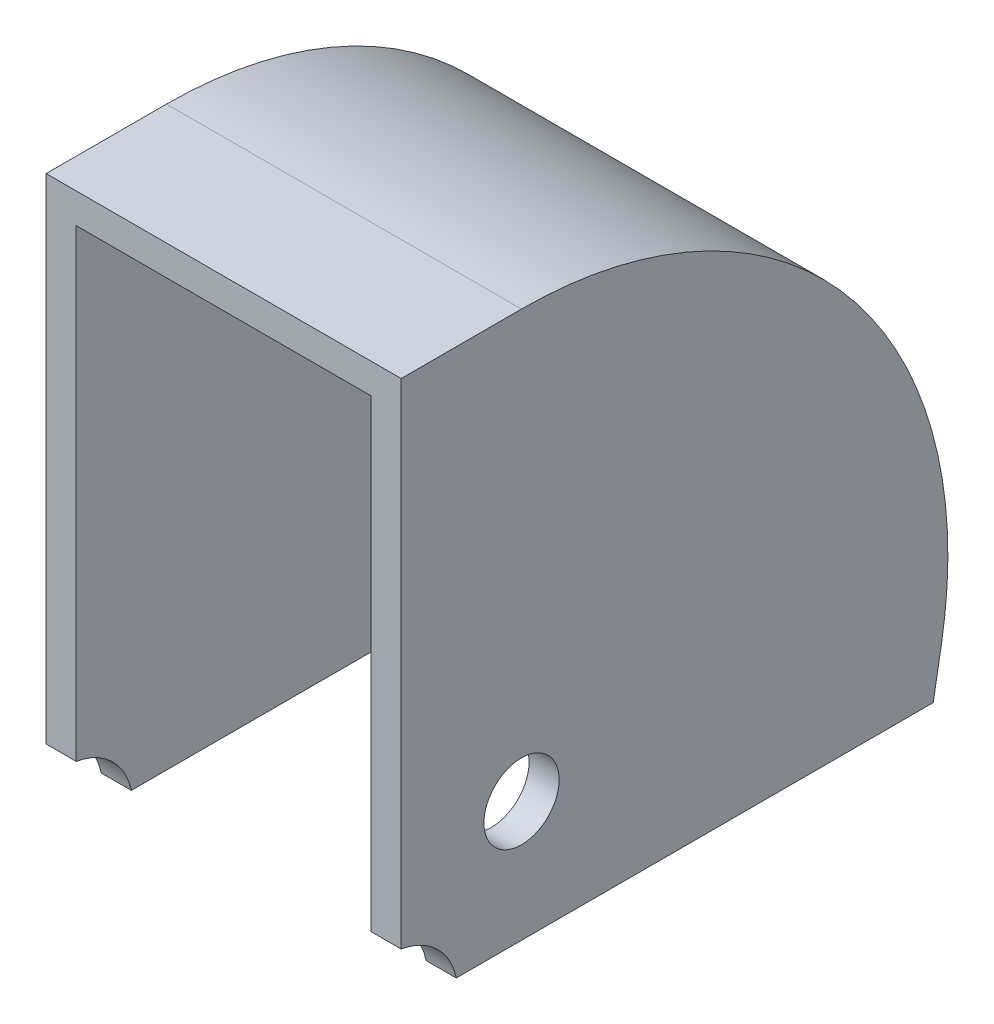
ISO-10303-21;
HEADER;
FILE_DESCRIPTION(('STEP AP214'),'2;1');
FILE_NAME('part.step','',(''),(''),'','','');
FILE_SCHEMA(('AUTOMOTIVE_DESIGN { 1 0 10303 214 1 1 1 1 }'));
ENDSEC;
DATA;
#1=APPLICATION_CONTEXT('core data for automotive mechanical design processes');
#2=APPLICATION_PROTOCOL_DEFINITION('international standard','automotive_design',2000,#1);
#3=PRODUCT_CONTEXT('',#1,'mechanical');
#4=PRODUCT('Part','Part','',(#3));
#5=PRODUCT_RELATED_PRODUCT_CATEGORY('part','',(#4));
#6=PRODUCT_DEFINITION_FORMATION('','',#4);
#7=PRODUCT_DEFINITION_CONTEXT('part definition',#1,'design');
#8=PRODUCT_DEFINITION('design','',#6,#7);
#9=PRODUCT_DEFINITION_SHAPE('','',#8);
#10=(LENGTH_UNIT() NAMED_UNIT(*) SI_UNIT(.MILLI.,.METRE.));
#11=(NAMED_UNIT(*) PLANE_ANGLE_UNIT() SI_UNIT($,.RADIAN.));
#12=(NAMED_UNIT(*) SI_UNIT($,.STERADIAN.) SOLID_ANGLE_UNIT());
#13=UNCERTAINTY_MEASURE_WITH_UNIT(LENGTH_MEASURE(1.E-05),#10,'distance_accuracy_value','');
#14=(GEOMETRIC_REPRESENTATION_CONTEXT(3) GLOBAL_UNCERTAINTY_ASSIGNED_CONTEXT((#13)) GLOBAL_UNIT_ASSIGNED_CONTEXT((#10,
#11,#12)) REPRESENTATION_CONTEXT('',''));
#15=CARTESIAN_POINT('',(0.,0.,0.));
#16=DIRECTION('',(0.,0.,1.));
#17=DIRECTION('',(1.,0.,0.));
#18=AXIS2_PLACEMENT_3D('',#15,#16,#17);
#19=CARTESIAN_POINT('',(2.,-8.93931415777547,8.73653907470971));
#20=DIRECTION('',(-1.,0.,0.));
#21=DIRECTION('',(0.,0.,1.));
#22=AXIS2_PLACEMENT_3D('',#19,#20,#21);
#23=CYLINDRICAL_SURFACE('',#22,4.5);
#24=CARTESIAN_POINT('',(0.,-8.93931415777547,8.73653907470971));
#25=DIRECTION('',(-1.,0.,0.));
#26=DIRECTION('',(0.,0.,1.));
#27=AXIS2_PLACEMENT_3D('',#24,#25,#26);
#28=CIRCLE('',#27,4.5);
#29=CARTESIAN_POINT('',(0.,-4.5,8.));
#30=VERTEX_POINT('',#29);
#31=CARTESIAN_POINT('',(0.,-8.,4.33566542133103));
#32=VERTEX_POINT('',#31);
#33=EDGE_CURVE('E191',#30,#32,#28,.T.);
#34=ORIENTED_EDGE('',*,*,#33,.T.);
#35=DIRECTION('',(-1.,0.,0.));
#36=VECTOR('',#35,1.);
#37=CARTESIAN_POINT('',(2.,-8.,4.33566542133103));
#38=LINE('',#37,#36);
#39=CARTESIAN_POINT('',(2.,-8.,4.33566542133103));
#40=VERTEX_POINT('',#39);
#41=EDGE_CURVE('E11',#40,#32,#38,.T.);
#42=ORIENTED_EDGE('',*,*,#41,.F.);
#43=CARTESIAN_POINT('',(2.,-8.93931415777547,8.73653907470971));
#44=DIRECTION('',(-1.,0.,0.));
#45=DIRECTION('',(0.,0.,1.));
#46=AXIS2_PLACEMENT_3D('',#43,#44,#45);
#47=CIRCLE('',#46,4.5);
#48=CARTESIAN_POINT('',(2.,-4.5,8.));
#49=VERTEX_POINT('',#48);
#50=EDGE_CURVE('E192',#49,#40,#47,.T.);
#51=ORIENTED_EDGE('',*,*,#50,.F.);
#52=DIRECTION('',(-1.,0.,0.));
#53=VECTOR('',#52,1.);
#54=CARTESIAN_POINT('',(2.,-4.5,8.));
#55=LINE('',#54,#53);
#56=EDGE_CURVE('E206',#49,#30,#55,.T.);
#57=ORIENTED_EDGE('',*,*,#56,.T.);
#58=EDGE_LOOP('',(#34,#42,#51,#57));
#59=FACE_BOUND('',#58,.T.);
#60=ADVANCED_FACE('F37',(#59),#23,.F.);
#61=CARTESIAN_POINT('',(2.,-8.,4.33566542133103));
#62=DIRECTION('',(0.,1.,0.));
#63=DIRECTION('',(0.,0.,1.));
#64=AXIS2_PLACEMENT_3D('',#61,#62,#63);
#65=PLANE('',#64);
#66=DIRECTION('',(0.,0.,-1.));
#67=VECTOR('',#66,1.);
#68=CARTESIAN_POINT('',(0.,-8.,4.33566542133103));
#69=LINE('',#68,#67);
#70=CARTESIAN_POINT('',(0.,-8.,-25.330760569627));
#71=VERTEX_POINT('',#70);
#72=EDGE_CURVE('E209',#32,#71,#69,.T.);
#73=ORIENTED_EDGE('',*,*,#72,.T.);
#74=DIRECTION('',(1.,0.,0.));
#75=VECTOR('',#74,1.);
#76=CARTESIAN_POINT('',(-9.79671523,-8.,-25.330760569627));
#77=LINE('',#76,#75);
#78=CARTESIAN_POINT('',(-19.59343046,-8.,-25.330760569627));
#79=VERTEX_POINT('',#78);
#80=EDGE_CURVE('E133',#79,#71,#77,.T.);
#81=ORIENTED_EDGE('',*,*,#80,.F.);
#82=DIRECTION('',(0.,0.,-1.));
#83=VECTOR('',#82,1.);
#84=CARTESIAN_POINT('',(-19.59343046,-8.,4.33566542133103));
#85=LINE('',#84,#83);
#86=CARTESIAN_POINT('',(-19.59343046,-8.,4.33566542133103));
#87=VERTEX_POINT('',#86);
#88=EDGE_CURVE('E147',#87,#79,#85,.T.);
#89=ORIENTED_EDGE('',*,*,#88,.F.);
#90=DIRECTION('',(1.,0.,0.));
#91=VECTOR('',#90,1.);
#92=CARTESIAN_POINT('',(-21.59343046,-8.,4.33566542133103));
#93=LINE('',#92,#91);
#94=CARTESIAN_POINT('',(-21.59343046,-8.,4.33566542133103));
#95=VERTEX_POINT('',#94);
#96=EDGE_CURVE('E179',#95,#87,#93,.T.);
#97=ORIENTED_EDGE('',*,*,#96,.F.);
#98=DIRECTION('',(0.,0.,-1.));
#99=VECTOR('',#98,1.);
#100=CARTESIAN_POINT('',(-21.59343046,-8.,4.33566542133103));
#101=LINE('',#100,#99);
#102=CARTESIAN_POINT('',(-21.59343046,-8.,-27.3616137933985));
#103=VERTEX_POINT('',#102);
#104=EDGE_CURVE('E158',#95,#103,#101,.T.);
#105=ORIENTED_EDGE('',*,*,#104,.T.);
#106=DIRECTION('',(-1.,0.,0.));
#107=VECTOR('',#106,1.);
#108=CARTESIAN_POINT('',(2.,-8.,-27.3616137933985));
#109=LINE('',#108,#107);
#110=CARTESIAN_POINT('',(2.,-8.,-27.3616137933985));
#111=VERTEX_POINT('',#110);
#112=EDGE_CURVE('E45',#111,#103,#109,.T.);
#113=ORIENTED_EDGE('',*,*,#112,.F.);
#114=DIRECTION('',(0.,0.,-1.));
#115=VECTOR('',#114,1.);
#116=CARTESIAN_POINT('',(2.,-8.,4.33566542133103));
#117=LINE('',#116,#115);
#118=EDGE_CURVE('E195',#40,#111,#117,.T.);
#119=ORIENTED_EDGE('',*,*,#118,.F.);
#120=ORIENTED_EDGE('',*,*,#41,.T.);
#121=EDGE_LOOP('',(#73,#81,#89,#97,#105,#113,#119,#120));
#122=FACE_BOUND('',#121,.T.);
#123=ADVANCED_FACE('F233',(#122),#65,.F.);
#124=CARTESIAN_POINT('',(2.,-8.,-27.3616137933985));
#125=DIRECTION('',(0.,0.173648177666926,0.984807753012209));
#126=DIRECTION('',(0.,-0.984807753012209,0.173648177666927));
#127=AXIS2_PLACEMENT_3D('',#124,#125,#126);
#128=PLANE('',#127);
#129=ORIENTED_EDGE('',*,*,#112,.T.);
#130=DIRECTION('',(0.,0.984807753012209,-0.173648177666927));
#131=VECTOR('',#130,1.);
#132=CARTESIAN_POINT('',(-21.59343046,-8.,-27.3616137933985));
#133=LINE('',#132,#131);
#134=CARTESIAN_POINT('',(-21.59343046,-4.92034105247611,-27.9046407572271));
#135=VERTEX_POINT('',#134);
#136=EDGE_CURVE('E162',#103,#135,#133,.T.);
#137=ORIENTED_EDGE('',*,*,#136,.T.);
#138=DIRECTION('',(-1.,0.,0.));
#139=VECTOR('',#138,1.);
#140=CARTESIAN_POINT('',(2.,-4.92034105247611,-27.9046407572271));
#141=LINE('',#140,#139);
#142=CARTESIAN_POINT('',(2.,-4.92034105247611,-27.9046407572271));
#143=VERTEX_POINT('',#142);
#144=EDGE_CURVE('E218',#143,#135,#141,.T.);
#145=ORIENTED_EDGE('',*,*,#144,.F.);
#146=DIRECTION('',(0.,0.984807753012209,-0.173648177666927));
#147=VECTOR('',#146,1.);
#148=CARTESIAN_POINT('',(2.,-8.,-27.3616137933985));
#149=LINE('',#148,#147);
#150=EDGE_CURVE('E198',#111,#143,#149,.T.);
#151=ORIENTED_EDGE('',*,*,#150,.F.);
#152=EDGE_LOOP('',(#129,#137,#145,#151));
#153=FACE_BOUND('',#152,.T.);
#154=ADVANCED_FACE('F224',(#153),#128,.F.);
#155=CARTESIAN_POINT('',(2.,0.,0.));
#156=DIRECTION('',(-1.,0.,0.));
#157=DIRECTION('',(0.,0.,1.));
#158=AXIS2_PLACEMENT_3D('',#155,#156,#157);
#159=CYLINDRICAL_SURFACE('',#158,28.33511482);
#160=ORIENTED_EDGE('',*,*,#144,.T.);
#161=CARTESIAN_POINT('',(-21.59343046,0.,0.));
#162=DIRECTION('',(1.,0.,0.));
#163=DIRECTION('',(0.,0.,1.));
#164=AXIS2_PLACEMENT_3D('',#161,#162,#163);
#165=CIRCLE('',#164,28.33511482);
#166=CARTESIAN_POINT('',(-21.59343046,28.33511482,0.));
#167=VERTEX_POINT('',#166);
#168=EDGE_CURVE('E165',#135,#167,#165,.T.);
#169=ORIENTED_EDGE('',*,*,#168,.T.);
#170=DIRECTION('',(-1.,0.,0.));
#171=VECTOR('',#170,1.);
#172=CARTESIAN_POINT('',(2.,28.33511482,0.));
#173=LINE('',#172,#171);
#174=CARTESIAN_POINT('',(2.,28.33511482,0.));
#175=VERTEX_POINT('',#174);
#176=EDGE_CURVE('E216',#175,#167,#173,.T.);
#177=ORIENTED_EDGE('',*,*,#176,.F.);
#178=CARTESIAN_POINT('',(2.,0.,0.));
#179=DIRECTION('',(1.,0.,0.));
#180=DIRECTION('',(0.,0.,1.));
#181=AXIS2_PLACEMENT_3D('',#178,#179,#180);
#182=CIRCLE('',#181,28.33511482);
#183=EDGE_CURVE('E200',#143,#175,#182,.T.);
#184=ORIENTED_EDGE('',*,*,#183,.F.);
#185=EDGE_LOOP('',(#160,#169,#177,#184));
#186=FACE_BOUND('',#185,.T.);
#187=ADVANCED_FACE('F248',(#186),#159,.T.);
#188=CARTESIAN_POINT('',(2.,28.33511482,8.));
#189=DIRECTION('',(0.,-1.,0.));
#190=DIRECTION('',(0.,0.,-1.));
#191=AXIS2_PLACEMENT_3D('',#188,#189,#190);
#192=PLANE('',#191);
#193=ORIENTED_EDGE('',*,*,#176,.T.);
#194=DIRECTION('',(0.,0.,1.));
#195=VECTOR('',#194,1.);
#196=CARTESIAN_POINT('',(-21.59343046,28.33511482,8.));
#197=LINE('',#196,#195);
#198=CARTESIAN_POINT('',(-21.59343046,28.33511482,8.));
#199=VERTEX_POINT('',#198);
#200=EDGE_CURVE('E168',#167,#199,#197,.T.);
#201=ORIENTED_EDGE('',*,*,#200,.T.);
#202=DIRECTION('',(-1.,0.,0.));
#203=VECTOR('',#202,1.);
#204=CARTESIAN_POINT('',(2.,28.33511482,8.));
#205=LINE('',#204,#203);
#206=CARTESIAN_POINT('',(2.,28.33511482,8.));
#207=VERTEX_POINT('',#206);
#208=EDGE_CURVE('E214',#207,#199,#205,.T.);
#209=ORIENTED_EDGE('',*,*,#208,.F.);
#210=DIRECTION('',(0.,0.,1.));
#211=VECTOR('',#210,1.);
#212=CARTESIAN_POINT('',(2.,28.33511482,8.));
#213=LINE('',#212,#211);
#214=EDGE_CURVE('E202',#175,#207,#213,.T.);
#215=ORIENTED_EDGE('',*,*,#214,.F.);
#216=EDGE_LOOP('',(#193,#201,#209,#215));
#217=FACE_BOUND('',#216,.T.);
#218=ADVANCED_FACE('F242',(#217),#192,.F.);
#219=CARTESIAN_POINT('',(2.,-4.5,8.));
#220=DIRECTION('',(0.,0.,-1.));
#221=DIRECTION('',(-1.,0.,0.));
#222=AXIS2_PLACEMENT_3D('',#219,#220,#221);
#223=PLANE('',#222);
#224=ORIENTED_EDGE('',*,*,#208,.T.);
#225=DIRECTION('',(0.,-1.,0.));
#226=VECTOR('',#225,1.);
#227=CARTESIAN_POINT('',(-21.59343046,-4.5,8.));
#228=LINE('',#227,#226);
#229=CARTESIAN_POINT('',(-21.59343046,-4.5,8.));
#230=VERTEX_POINT('',#229);
#231=EDGE_CURVE('E171',#199,#230,#228,.T.);
#232=ORIENTED_EDGE('',*,*,#231,.T.);
#233=DIRECTION('',(1.,0.,0.));
#234=VECTOR('',#233,1.);
#235=CARTESIAN_POINT('',(-21.59343046,-4.5,8.));
#236=LINE('',#235,#234);
#237=CARTESIAN_POINT('',(-19.59343046,-4.5,8.));
#238=VERTEX_POINT('',#237);
#239=EDGE_CURVE('E173',#230,#238,#236,.T.);
#240=ORIENTED_EDGE('',*,*,#239,.T.);
#241=DIRECTION('',(0.,-1.,0.));
#242=VECTOR('',#241,1.);
#243=CARTESIAN_POINT('',(-19.59343046,-4.5,8.));
#244=LINE('',#243,#242);
#245=CARTESIAN_POINT('',(-19.59343046,26.33511482,8.));
#246=VERTEX_POINT('',#245);
#247=EDGE_CURVE('E159',#246,#238,#244,.T.);
#248=ORIENTED_EDGE('',*,*,#247,.F.);
#249=DIRECTION('',(1.,0.,0.));
#250=VECTOR('',#249,1.);
#251=CARTESIAN_POINT('',(-9.79671523,26.33511482,8.));
#252=LINE('',#251,#250);
#253=CARTESIAN_POINT('',(0.,26.33511482,8.));
#254=VERTEX_POINT('',#253);
#255=EDGE_CURVE('E186',#246,#254,#252,.T.);
#256=ORIENTED_EDGE('',*,*,#255,.T.);
#257=DIRECTION('',(0.,-1.,0.));
#258=VECTOR('',#257,1.);
#259=CARTESIAN_POINT('',(0.,-4.5,8.));
#260=LINE('',#259,#258);
#261=EDGE_CURVE('E196',#254,#30,#260,.T.);
#262=ORIENTED_EDGE('',*,*,#261,.T.);
#263=ORIENTED_EDGE('',*,*,#56,.F.);
#264=DIRECTION('',(0.,-1.,0.));
#265=VECTOR('',#264,1.);
#266=CARTESIAN_POINT('',(2.,-4.5,8.));
#267=LINE('',#266,#265);
#268=EDGE_CURVE('E204',#207,#49,#267,.T.);
#269=ORIENTED_EDGE('',*,*,#268,.F.);
#270=EDGE_LOOP('',(#224,#232,#240,#248,#256,#262,#263,#269));
#271=FACE_BOUND('',#270,.T.);
#272=ADVANCED_FACE('F260',(#271),#223,.F.);
#273=CARTESIAN_POINT('',(2.,-8.93931415777547,8.73653907470971));
#274=DIRECTION('',(-1.,0.,0.));
#275=DIRECTION('',(0.,0.,1.));
#276=AXIS2_PLACEMENT_3D('',#273,#274,#275);
#277=PLANE('',#276);
#278=CARTESIAN_POINT('',(2.,0.,0.));
#279=DIRECTION('',(1.,0.,0.));
#280=DIRECTION('',(0.,0.,-1.));
#281=AXIS2_PLACEMENT_3D('',#278,#279,#280);
#282=CIRCLE('',#281,2.5);
#283=CARTESIAN_POINT('',(2.,0.,-2.5));
#284=VERTEX_POINT('',#283);
#285=EDGE_CURVE('E150',#284,#284,#282,.T.);
#286=ORIENTED_EDGE('',*,*,#285,.F.);
#287=EDGE_LOOP('',(#286));
#288=FACE_BOUND('',#287,.T.);
#289=ORIENTED_EDGE('',*,*,#50,.T.);
#290=ORIENTED_EDGE('',*,*,#118,.T.);
#291=ORIENTED_EDGE('',*,*,#150,.T.);
#292=ORIENTED_EDGE('',*,*,#183,.T.);
#293=ORIENTED_EDGE('',*,*,#214,.T.);
#294=ORIENTED_EDGE('',*,*,#268,.T.);
#295=EDGE_LOOP('',(#289,#290,#291,#292,#293,#294));
#296=FACE_BOUND('',#295,.T.);
#297=ADVANCED_FACE('F250',(#288,#296),#277,.F.);
#298=CARTESIAN_POINT('',(0.,-8.93931415777547,8.73653907470971));
#299=DIRECTION('',(-1.,0.,0.));
#300=DIRECTION('',(0.,0.,1.));
#301=AXIS2_PLACEMENT_3D('',#298,#299,#300);
#302=PLANE('',#301);
#303=CARTESIAN_POINT('',(0.,0.,0.));
#304=DIRECTION('',(-1.,0.,0.));
#305=DIRECTION('',(0.,0.,1.));
#306=AXIS2_PLACEMENT_3D('',#303,#304,#305);
#307=CIRCLE('',#306,2.5);
#308=CARTESIAN_POINT('',(0.,0.,-2.5));
#309=VERTEX_POINT('',#308);
#310=EDGE_CURVE('E40',#309,#309,#307,.T.);
#311=ORIENTED_EDGE('',*,*,#310,.F.);
#312=EDGE_LOOP('',(#311));
#313=FACE_BOUND('',#312,.T.);
#314=DIRECTION('',(0.,0.,1.));
#315=VECTOR('',#314,1.);
#316=CARTESIAN_POINT('',(0.,26.33511482,8.));
#317=LINE('',#316,#315);
#318=CARTESIAN_POINT('',(0.,26.33511482,0.));
#319=VERTEX_POINT('',#318);
#320=EDGE_CURVE('E52',#319,#254,#317,.T.);
#321=ORIENTED_EDGE('',*,*,#320,.F.);
#322=CARTESIAN_POINT('',(0.,0.,0.));
#323=DIRECTION('',(1.,0.,0.));
#324=DIRECTION('',(0.,0.,1.));
#325=AXIS2_PLACEMENT_3D('',#322,#323,#324);
#326=CIRCLE('',#325,26.33511482);
#327=CARTESIAN_POINT('',(0.,-4.57304469714225,-25.9350252512027));
#328=VERTEX_POINT('',#327);
#329=EDGE_CURVE('E183',#328,#319,#326,.T.);
#330=ORIENTED_EDGE('',*,*,#329,.F.);
#331=DIRECTION('',(0.,0.984807753012209,-0.173648177666926));
#332=VECTOR('',#331,1.);
#333=CARTESIAN_POINT('',(0.,-8.,-25.330760569627));
#334=LINE('',#333,#332);
#335=EDGE_CURVE('E58',#71,#328,#334,.T.);
#336=ORIENTED_EDGE('',*,*,#335,.F.);
#337=ORIENTED_EDGE('',*,*,#72,.F.);
#338=ORIENTED_EDGE('',*,*,#33,.F.);
#339=ORIENTED_EDGE('',*,*,#261,.F.);
#340=EDGE_LOOP('',(#321,#330,#336,#337,#338,#339));
#341=FACE_BOUND('',#340,.T.);
#342=ADVANCED_FACE('F256',(#313,#341),#302,.T.);
#343=CARTESIAN_POINT('',(-9.79671523,-8.,-25.330760569627));
#344=DIRECTION('',(0.,-0.173648177666926,-0.984807753012209));
#345=DIRECTION('',(0.,0.984807753012209,-0.173648177666926));
#346=AXIS2_PLACEMENT_3D('',#343,#344,#345);
#347=PLANE('',#346);
#348=ORIENTED_EDGE('',*,*,#335,.T.);
#349=DIRECTION('',(1.,0.,0.));
#350=VECTOR('',#349,1.);
#351=CARTESIAN_POINT('',(-9.79671523,-4.57304469714225,-25.9350252512027));
#352=LINE('',#351,#350);
#353=CARTESIAN_POINT('',(-19.59343046,-4.57304469714225,-25.9350252512027));
#354=VERTEX_POINT('',#353);
#355=EDGE_CURVE('E125',#354,#328,#352,.T.);
#356=ORIENTED_EDGE('',*,*,#355,.F.);
#357=DIRECTION('',(0.,0.984807753012209,-0.173648177666926));
#358=VECTOR('',#357,1.);
#359=CARTESIAN_POINT('',(-19.59343046,-8.,-25.330760569627));
#360=LINE('',#359,#358);
#361=EDGE_CURVE('E130',#79,#354,#360,.T.);
#362=ORIENTED_EDGE('',*,*,#361,.F.);
#363=ORIENTED_EDGE('',*,*,#80,.T.);
#364=EDGE_LOOP('',(#348,#356,#362,#363));
#365=FACE_BOUND('',#364,.T.);
#366=ADVANCED_FACE('F127',(#365),#347,.F.);
#367=CARTESIAN_POINT('',(-9.79671523,0.,0.));
#368=DIRECTION('',(1.,0.,0.));
#369=DIRECTION('',(0.,0.,-1.));
#370=AXIS2_PLACEMENT_3D('',#367,#368,#369);
#371=CYLINDRICAL_SURFACE('',#370,26.33511482);
#372=ORIENTED_EDGE('',*,*,#329,.T.);
#373=DIRECTION('',(1.,0.,0.));
#374=VECTOR('',#373,1.);
#375=CARTESIAN_POINT('',(-9.79671523,26.33511482,0.));
#376=LINE('',#375,#374);
#377=CARTESIAN_POINT('',(-19.59343046,26.33511482,0.));
#378=VERTEX_POINT('',#377);
#379=EDGE_CURVE('E134',#378,#319,#376,.T.);
#380=ORIENTED_EDGE('',*,*,#379,.F.);
#381=CARTESIAN_POINT('',(-19.59343046,0.,0.));
#382=DIRECTION('',(1.,0.,0.));
#383=DIRECTION('',(0.,0.,1.));
#384=AXIS2_PLACEMENT_3D('',#381,#382,#383);
#385=CIRCLE('',#384,26.33511482);
#386=EDGE_CURVE('E137',#354,#378,#385,.T.);
#387=ORIENTED_EDGE('',*,*,#386,.F.);
#388=ORIENTED_EDGE('',*,*,#355,.T.);
#389=EDGE_LOOP('',(#372,#380,#387,#388));
#390=FACE_BOUND('',#389,.T.);
#391=ADVANCED_FACE('F138',(#390),#371,.F.);
#392=CARTESIAN_POINT('',(-9.79671523,26.33511482,8.));
#393=DIRECTION('',(0.,1.,0.));
#394=DIRECTION('',(0.,0.,1.));
#395=AXIS2_PLACEMENT_3D('',#392,#393,#394);
#396=PLANE('',#395);
#397=ORIENTED_EDGE('',*,*,#320,.T.);
#398=ORIENTED_EDGE('',*,*,#255,.F.);
#399=DIRECTION('',(0.,0.,1.));
#400=VECTOR('',#399,1.);
#401=CARTESIAN_POINT('',(-19.59343046,26.33511482,8.));
#402=LINE('',#401,#400);
#403=EDGE_CURVE('E143',#378,#246,#402,.T.);
#404=ORIENTED_EDGE('',*,*,#403,.F.);
#405=ORIENTED_EDGE('',*,*,#379,.T.);
#406=EDGE_LOOP('',(#397,#398,#404,#405));
#407=FACE_BOUND('',#406,.T.);
#408=ADVANCED_FACE('F258',(#407),#396,.F.);
#409=CARTESIAN_POINT('',(-21.59343046,-8.93931415777547,8.73653907470971));
#410=DIRECTION('',(1.,0.,0.));
#411=DIRECTION('',(0.,0.,1.));
#412=AXIS2_PLACEMENT_3D('',#409,#410,#411);
#413=CYLINDRICAL_SURFACE('',#412,4.5);
#414=CARTESIAN_POINT('',(-19.59343046,-8.93931415777547,8.73653907470971));
#415=DIRECTION('',(-1.,0.,0.));
#416=DIRECTION('',(0.,0.,1.));
#417=AXIS2_PLACEMENT_3D('',#414,#415,#416);
#418=CIRCLE('',#417,4.5);
#419=EDGE_CURVE('E154',#238,#87,#418,.T.);
#420=ORIENTED_EDGE('',*,*,#419,.F.);
#421=ORIENTED_EDGE('',*,*,#239,.F.);
#422=CARTESIAN_POINT('',(-21.59343046,-8.93931415777547,8.73653907470971));
#423=DIRECTION('',(-1.,0.,0.));
#424=DIRECTION('',(0.,0.,1.));
#425=AXIS2_PLACEMENT_3D('',#422,#423,#424);
#426=CIRCLE('',#425,4.5);
#427=EDGE_CURVE('E155',#230,#95,#426,.T.);
#428=ORIENTED_EDGE('',*,*,#427,.T.);
#429=ORIENTED_EDGE('',*,*,#96,.T.);
#430=EDGE_LOOP('',(#420,#421,#428,#429));
#431=FACE_BOUND('',#430,.T.);
#432=ADVANCED_FACE('F237',(#431),#413,.F.);
#433=CARTESIAN_POINT('',(-21.59343046,-8.93931415777547,8.73653907470971));
#434=DIRECTION('',(1.,0.,0.));
#435=DIRECTION('',(0.,0.,1.));
#436=AXIS2_PLACEMENT_3D('',#433,#434,#435);
#437=PLANE('',#436);
#438=ORIENTED_EDGE('',*,*,#427,.F.);
#439=ORIENTED_EDGE('',*,*,#231,.F.);
#440=ORIENTED_EDGE('',*,*,#200,.F.);
#441=ORIENTED_EDGE('',*,*,#168,.F.);
#442=ORIENTED_EDGE('',*,*,#136,.F.);
#443=ORIENTED_EDGE('',*,*,#104,.F.);
#444=EDGE_LOOP('',(#438,#439,#440,#441,#442,#443));
#445=FACE_BOUND('',#444,.T.);
#446=ADVANCED_FACE('F230',(#445),#437,.F.);
#447=CARTESIAN_POINT('',(-19.59343046,-8.93931415777547,8.73653907470971));
#448=DIRECTION('',(1.,0.,0.));
#449=DIRECTION('',(0.,0.,1.));
#450=AXIS2_PLACEMENT_3D('',#447,#448,#449);
#451=PLANE('',#450);
#452=ORIENTED_EDGE('',*,*,#403,.T.);
#453=ORIENTED_EDGE('',*,*,#247,.T.);
#454=ORIENTED_EDGE('',*,*,#419,.T.);
#455=ORIENTED_EDGE('',*,*,#88,.T.);
#456=ORIENTED_EDGE('',*,*,#361,.T.);
#457=ORIENTED_EDGE('',*,*,#386,.T.);
#458=EDGE_LOOP('',(#452,#453,#454,#455,#456,#457));
#459=FACE_BOUND('',#458,.T.);
#460=ADVANCED_FACE('F145',(#459),#451,.T.);
#461=CARTESIAN_POINT('',(-11.,0.,0.));
#462=DIRECTION('',(1.,0.,0.));
#463=DIRECTION('',(0.,0.,-1.));
#464=AXIS2_PLACEMENT_3D('',#461,#462,#463);
#465=CYLINDRICAL_SURFACE('',#464,2.5);
#466=CARTESIAN_POINT('',(0.,0.,-2.5));
#467=CARTESIAN_POINT('',(0.0208333333333351,0.,-2.5));
#468=CARTESIAN_POINT('',(0.0416666666666684,0.,-2.5));
#469=CARTESIAN_POINT('',(0.0833333333333352,0.,-2.5));
#470=CARTESIAN_POINT('',(0.104166666666669,0.,-2.5));
#471=CARTESIAN_POINT('',(0.145833333333335,0.,-2.5));
#472=CARTESIAN_POINT('',(0.166666666666669,0.,-2.5));
#473=CARTESIAN_POINT('',(0.208333333333335,0.,-2.5));
#474=CARTESIAN_POINT('',(0.229166666666669,0.,-2.5));
#475=CARTESIAN_POINT('',(0.270833333333335,0.,-2.5));
#476=CARTESIAN_POINT('',(0.291666666666669,0.,-2.5));
#477=CARTESIAN_POINT('',(0.333333333333335,0.,-2.5));
#478=CARTESIAN_POINT('',(0.354166666666669,0.,-2.5));
#479=CARTESIAN_POINT('',(0.395833333333335,0.,-2.5));
#480=CARTESIAN_POINT('',(0.416666666666669,0.,-2.5));
#481=CARTESIAN_POINT('',(0.458333333333335,0.,-2.5));
#482=CARTESIAN_POINT('',(0.479166666666669,0.,-2.5));
#483=CARTESIAN_POINT('',(0.520833333333335,0.,-2.5));
#484=CARTESIAN_POINT('',(0.541666666666668,0.,-2.5));
#485=CARTESIAN_POINT('',(0.583333333333334,0.,-2.5));
#486=CARTESIAN_POINT('',(0.604166666666667,0.,-2.5));
#487=CARTESIAN_POINT('',(0.645833333333334,0.,-2.5));
#488=CARTESIAN_POINT('',(0.666666666666667,0.,-2.5));
#489=CARTESIAN_POINT('',(0.708333333333334,0.,-2.5));
#490=CARTESIAN_POINT('',(0.729166666666667,0.,-2.5));
#491=CARTESIAN_POINT('',(0.770833333333334,0.,-2.5));
#492=CARTESIAN_POINT('',(0.791666666666667,0.,-2.5));
#493=CARTESIAN_POINT('',(0.833333333333334,0.,-2.5));
#494=CARTESIAN_POINT('',(0.854166666666667,0.,-2.5));
#495=CARTESIAN_POINT('',(0.895833333333334,0.,-2.5));
#496=CARTESIAN_POINT('',(0.916666666666668,0.,-2.5));
#497=CARTESIAN_POINT('',(0.958333333333334,0.,-2.5));
#498=CARTESIAN_POINT('',(0.979166666666668,0.,-2.5));
#499=CARTESIAN_POINT('',(1.02083333333333,0.,-2.5));
#500=CARTESIAN_POINT('',(1.04166666666667,0.,-2.5));
#501=CARTESIAN_POINT('',(1.08333333333333,0.,-2.5));
#502=CARTESIAN_POINT('',(1.10416666666667,0.,-2.5));
#503=CARTESIAN_POINT('',(1.14583333333333,0.,-2.5));
#504=CARTESIAN_POINT('',(1.16666666666667,0.,-2.5));
#505=CARTESIAN_POINT('',(1.20833333333333,0.,-2.5));
#506=CARTESIAN_POINT('',(1.22916666666667,0.,-2.5));
#507=CARTESIAN_POINT('',(1.27083333333333,0.,-2.5));
#508=CARTESIAN_POINT('',(1.29166666666667,0.,-2.5));
#509=CARTESIAN_POINT('',(1.33333333333333,0.,-2.5));
#510=CARTESIAN_POINT('',(1.35416666666667,0.,-2.5));
#511=CARTESIAN_POINT('',(1.39583333333333,0.,-2.5));
#512=CARTESIAN_POINT('',(1.41666666666667,0.,-2.5));
#513=CARTESIAN_POINT('',(1.45833333333333,0.,-2.5));
#514=CARTESIAN_POINT('',(1.47916666666667,0.,-2.5));
#515=CARTESIAN_POINT('',(1.52083333333333,0.,-2.5));
#516=CARTESIAN_POINT('',(1.54166666666667,0.,-2.5));
#517=CARTESIAN_POINT('',(1.58333333333333,0.,-2.5));
#518=CARTESIAN_POINT('',(1.60416666666667,0.,-2.5));
#519=CARTESIAN_POINT('',(1.64583333333333,0.,-2.5));
#520=CARTESIAN_POINT('',(1.66666666666667,0.,-2.5));
#521=CARTESIAN_POINT('',(1.70833333333333,0.,-2.5));
#522=CARTESIAN_POINT('',(1.72916666666667,0.,-2.5));
#523=CARTESIAN_POINT('',(1.77083333333333,0.,-2.5));
#524=CARTESIAN_POINT('',(1.79166666666667,0.,-2.5));
#525=CARTESIAN_POINT('',(1.83333333333333,0.,-2.5));
#526=CARTESIAN_POINT('',(1.85416666666667,0.,-2.5));
#527=CARTESIAN_POINT('',(1.89583333333333,0.,-2.5));
#528=CARTESIAN_POINT('',(1.91666666666667,0.,-2.5));
#529=CARTESIAN_POINT('',(1.95833333333333,0.,-2.5));
#530=CARTESIAN_POINT('',(1.97916666666667,0.,-2.5));
#531=CARTESIAN_POINT('',(2.,0.,-2.5));
#532=B_SPLINE_CURVE_WITH_KNOTS('',3,(#466,#467,#468,#469,#470,#471,#472,#473,#474,#475,#476,
#477,#478,#479,#480,#481,#482,#483,#484,#485,#486,#487,#488,#489,#490,#491,#492,#493,#494,#495,
#496,#497,#498,#499,#500,#501,#502,#503,#504,#505,#506,#507,#508,#509,#510,#511,#512,#513,#514,
#515,#516,#517,#518,#519,#520,#521,#522,#523,#524,#525,#526,#527,#528,#529,#530,#531),
.UNSPECIFIED.,.F.,.F.,(4,2,2,2,2,2,2,2,2,2,2,2,2,2,2,2,2,2,2,2,2,2,2,2,2,2,2,2,2,2,2,2,4),(0.,
0.0625000000000001,0.125,0.1875,0.25,0.3125,0.375,0.4375,0.5,0.562499999999999,
0.624999999999999,0.687499999999999,0.749999999999999,0.812499999999999,0.874999999999999,
0.937499999999999,0.999999999999999,1.0625,1.125,1.1875,1.25,1.3125,1.375,1.4375,1.5,1.5625,
1.625,1.6875,1.75,1.8125,1.875,1.9375,2.),.UNSPECIFIED.);
#533=EDGE_CURVE('BSEAM350',#309,#284,#532,.T.);
#534=ORIENTED_EDGE('',*,*,#310,.T.);
#535=ORIENTED_EDGE('',*,*,#285,.T.);
#536=ORIENTED_EDGE('',*,*,#533,.T.);
#537=ORIENTED_EDGE('',*,*,#533,.F.);
#538=EDGE_LOOP('',(#534,#536,#535,#537));
#539=FACE_BOUND('',#538,.T.);
#540=ADVANCED_FACE('F350',(#539),#465,.F.);
#541=CLOSED_SHELL('',(#60,#123,#154,#187,#218,#272,#297,#342,#366,#391,#408,#432,#446,#460,#540));
#542=MANIFOLD_SOLID_BREP('B2',#541);
#543=ADVANCED_BREP_SHAPE_REPRESENTATION('',(#18,#542),#14);
#544=SHAPE_DEFINITION_REPRESENTATION(#9,#543);
ENDSEC;
END-ISO-10303-21;
